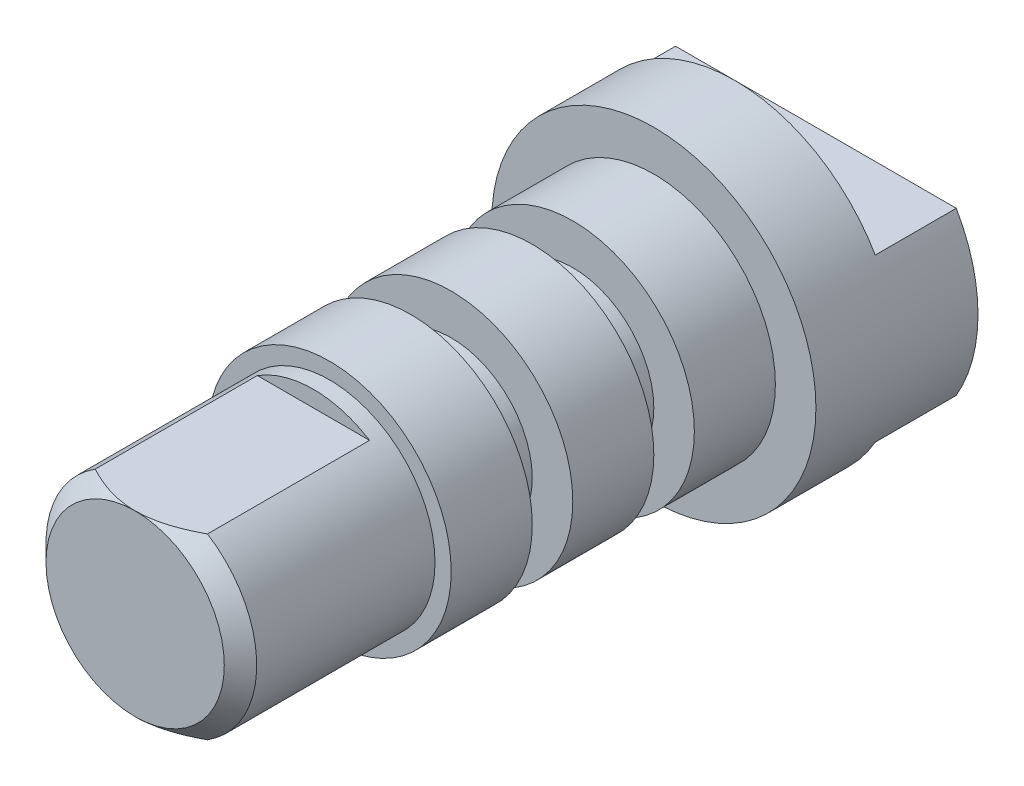
ISO-10303-21;
HEADER;
FILE_DESCRIPTION(('STEP AP214'),'2;1');
FILE_NAME('part.step','',(''),(''),'','','');
FILE_SCHEMA(('AUTOMOTIVE_DESIGN { 1 0 10303 214 1 1 1 1 }'));
ENDSEC;
DATA;
#1=APPLICATION_CONTEXT('core data for automotive mechanical design processes');
#2=APPLICATION_PROTOCOL_DEFINITION('international standard','automotive_design',2000,#1);
#3=PRODUCT_CONTEXT('',#1,'mechanical');
#4=PRODUCT('Part','Part','',(#3));
#5=PRODUCT_RELATED_PRODUCT_CATEGORY('part','',(#4));
#6=PRODUCT_DEFINITION_FORMATION('','',#4);
#7=PRODUCT_DEFINITION_CONTEXT('part definition',#1,'design');
#8=PRODUCT_DEFINITION('design','',#6,#7);
#9=PRODUCT_DEFINITION_SHAPE('','',#8);
#10=(LENGTH_UNIT() NAMED_UNIT(*) SI_UNIT(.MILLI.,.METRE.));
#11=(NAMED_UNIT(*) PLANE_ANGLE_UNIT() SI_UNIT($,.RADIAN.));
#12=(NAMED_UNIT(*) SI_UNIT($,.STERADIAN.) SOLID_ANGLE_UNIT());
#13=UNCERTAINTY_MEASURE_WITH_UNIT(LENGTH_MEASURE(1.E-05),#10,'distance_accuracy_value','');
#14=(GEOMETRIC_REPRESENTATION_CONTEXT(3) GLOBAL_UNCERTAINTY_ASSIGNED_CONTEXT((#13)) GLOBAL_UNIT_ASSIGNED_CONTEXT((#10,
#11,#12)) REPRESENTATION_CONTEXT('',''));
#15=CARTESIAN_POINT('',(0.,0.,0.));
#16=DIRECTION('',(0.,0.,1.));
#17=DIRECTION('',(1.,0.,0.));
#18=AXIS2_PLACEMENT_3D('',#15,#16,#17);
#19=CARTESIAN_POINT('',(0.,0.,5.));
#20=DIRECTION('',(0.,0.,-1.));
#21=DIRECTION('',(-1.,0.,0.));
#22=AXIS2_PLACEMENT_3D('',#19,#20,#21);
#23=CYLINDRICAL_SURFACE('',#22,10.);
#24=CARTESIAN_POINT('',(0.,0.,5.));
#25=DIRECTION('',(0.,0.,1.));
#26=DIRECTION('',(1.,0.,0.));
#27=AXIS2_PLACEMENT_3D('',#24,#25,#26);
#28=CIRCLE('',#27,10.);
#29=CARTESIAN_POINT('',(10.,0.,5.));
#30=VERTEX_POINT('',#29);
#31=EDGE_CURVE('E201',#30,#30,#28,.T.);
#32=ORIENTED_EDGE('',*,*,#31,.F.);
#33=EDGE_LOOP('',(#32));
#34=FACE_BOUND('',#33,.T.);
#35=CARTESIAN_POINT('',(0.,0.,0.));
#36=DIRECTION('',(0.,0.,-1.));
#37=DIRECTION('',(1.,0.,0.));
#38=AXIS2_PLACEMENT_3D('',#35,#36,#37);
#39=CIRCLE('',#38,10.);
#40=CARTESIAN_POINT('',(-8.66025403784439,5.,0.));
#41=VERTEX_POINT('',#40);
#42=CARTESIAN_POINT('',(8.66025403784438,5.,0.));
#43=VERTEX_POINT('',#42);
#44=EDGE_CURVE('E118',#41,#43,#39,.T.);
#45=ORIENTED_EDGE('',*,*,#44,.F.);
#46=DIRECTION('',(0.,0.,-1.));
#47=VECTOR('',#46,1.);
#48=CARTESIAN_POINT('',(-8.66025403784439,5.,0.));
#49=LINE('',#48,#47);
#50=CARTESIAN_POINT('',(-8.66025403784439,5.,-5.));
#51=VERTEX_POINT('',#50);
#52=EDGE_CURVE('E131',#41,#51,#49,.T.);
#53=ORIENTED_EDGE('',*,*,#52,.T.);
#54=CARTESIAN_POINT('',(0.,0.,-5.));
#55=DIRECTION('',(0.,0.,-1.));
#56=DIRECTION('',(-1.,0.,0.));
#57=AXIS2_PLACEMENT_3D('',#54,#55,#56);
#58=CIRCLE('',#57,10.);
#59=CARTESIAN_POINT('',(-8.66025403784439,-5.,-5.));
#60=VERTEX_POINT('',#59);
#61=EDGE_CURVE('E138',#60,#51,#58,.T.);
#62=ORIENTED_EDGE('',*,*,#61,.F.);
#63=DIRECTION('',(0.,0.,-1.));
#64=VECTOR('',#63,1.);
#65=CARTESIAN_POINT('',(-8.66025403784439,-5.,0.));
#66=LINE('',#65,#64);
#67=CARTESIAN_POINT('',(-8.66025403784439,-5.,0.));
#68=VERTEX_POINT('',#67);
#69=EDGE_CURVE('E142',#68,#60,#66,.T.);
#70=ORIENTED_EDGE('',*,*,#69,.F.);
#71=CARTESIAN_POINT('',(0.,0.,0.));
#72=DIRECTION('',(0.,0.,-1.));
#73=DIRECTION('',(-1.,0.,0.));
#74=AXIS2_PLACEMENT_3D('',#71,#72,#73);
#75=CIRCLE('',#74,10.);
#76=CARTESIAN_POINT('',(8.66025403784438,-5.,0.));
#77=VERTEX_POINT('',#76);
#78=EDGE_CURVE('E149',#77,#68,#75,.T.);
#79=ORIENTED_EDGE('',*,*,#78,.F.);
#80=DIRECTION('',(0.,0.,-1.));
#81=VECTOR('',#80,1.);
#82=CARTESIAN_POINT('',(8.66025403784438,-5.,0.));
#83=LINE('',#82,#81);
#84=CARTESIAN_POINT('',(8.66025403784438,-5.,-5.));
#85=VERTEX_POINT('',#84);
#86=EDGE_CURVE('E145',#77,#85,#83,.T.);
#87=ORIENTED_EDGE('',*,*,#86,.T.);
#88=CARTESIAN_POINT('',(8.66025403784439,5.,-5.));
#89=VERTEX_POINT('',#88);
#90=EDGE_CURVE('E136',#89,#85,#58,.T.);
#91=ORIENTED_EDGE('',*,*,#90,.F.);
#92=DIRECTION('',(0.,0.,-1.));
#93=VECTOR('',#92,1.);
#94=CARTESIAN_POINT('',(8.66025403784438,5.,0.));
#95=LINE('',#94,#93);
#96=EDGE_CURVE('E129',#43,#89,#95,.T.);
#97=ORIENTED_EDGE('',*,*,#96,.F.);
#98=EDGE_LOOP('',(#45,#53,#62,#70,#79,#87,#91,#97));
#99=FACE_BOUND('',#98,.T.);
#100=ADVANCED_FACE('F41',(#34,#99),#23,.T.);
#101=CARTESIAN_POINT('',(0.,0.,5.));
#102=DIRECTION('',(0.,0.,1.));
#103=DIRECTION('',(1.,0.,0.));
#104=AXIS2_PLACEMENT_3D('',#101,#102,#103);
#105=PLANE('',#104);
#106=CARTESIAN_POINT('',(0.,0.,5.));
#107=DIRECTION('',(0.,0.,1.));
#108=DIRECTION('',(1.,0.,0.));
#109=AXIS2_PLACEMENT_3D('',#106,#107,#108);
#110=CIRCLE('',#109,7.5);
#111=CARTESIAN_POINT('',(7.5,0.,5.));
#112=VERTEX_POINT('',#111);
#113=EDGE_CURVE('E198',#112,#112,#110,.T.);
#114=ORIENTED_EDGE('',*,*,#113,.F.);
#115=EDGE_LOOP('',(#114));
#116=FACE_BOUND('',#115,.T.);
#117=ORIENTED_EDGE('',*,*,#31,.T.);
#118=EDGE_LOOP('',(#117));
#119=FACE_BOUND('',#118,.T.);
#120=ADVANCED_FACE('F274',(#116,#119),#105,.T.);
#121=CARTESIAN_POINT('',(0.,0.,10.));
#122=DIRECTION('',(0.,0.,-1.));
#123=DIRECTION('',(-1.,0.,0.));
#124=AXIS2_PLACEMENT_3D('',#121,#122,#123);
#125=CYLINDRICAL_SURFACE('',#124,7.5);
#126=CARTESIAN_POINT('',(0.,0.,10.));
#127=DIRECTION('',(0.,0.,1.));
#128=DIRECTION('',(1.,0.,0.));
#129=AXIS2_PLACEMENT_3D('',#126,#127,#128);
#130=CIRCLE('',#129,7.5);
#131=CARTESIAN_POINT('',(7.5,0.,10.));
#132=VERTEX_POINT('',#131);
#133=EDGE_CURVE('E195',#132,#132,#130,.T.);
#134=ORIENTED_EDGE('',*,*,#133,.F.);
#135=EDGE_LOOP('',(#134));
#136=FACE_BOUND('',#135,.T.);
#137=ORIENTED_EDGE('',*,*,#113,.T.);
#138=EDGE_LOOP('',(#137));
#139=FACE_BOUND('',#138,.T.);
#140=ADVANCED_FACE('F282',(#136,#139),#125,.T.);
#141=CARTESIAN_POINT('',(0.,0.,10.));
#142=DIRECTION('',(0.,0.,1.));
#143=DIRECTION('',(1.,0.,0.));
#144=AXIS2_PLACEMENT_3D('',#141,#142,#143);
#145=PLANE('',#144);
#146=CARTESIAN_POINT('',(0.,0.,10.));
#147=DIRECTION('',(0.,0.,1.));
#148=DIRECTION('',(1.,0.,0.));
#149=AXIS2_PLACEMENT_3D('',#146,#147,#148);
#150=CIRCLE('',#149,5.);
#151=CARTESIAN_POINT('',(5.,0.,10.));
#152=VERTEX_POINT('',#151);
#153=EDGE_CURVE('E186',#152,#152,#150,.T.);
#154=ORIENTED_EDGE('',*,*,#153,.F.);
#155=EDGE_LOOP('',(#154));
#156=FACE_BOUND('',#155,.T.);
#157=ORIENTED_EDGE('',*,*,#133,.T.);
#158=EDGE_LOOP('',(#157));
#159=FACE_BOUND('',#158,.T.);
#160=ADVANCED_FACE('F296',(#156,#159),#145,.T.);
#161=CARTESIAN_POINT('',(0.,0.,12.5));
#162=DIRECTION('',(0.,0.,-1.));
#163=DIRECTION('',(-1.,0.,0.));
#164=AXIS2_PLACEMENT_3D('',#161,#162,#163);
#165=CYLINDRICAL_SURFACE('',#164,5.);
#166=CARTESIAN_POINT('',(0.,0.,12.5));
#167=DIRECTION('',(0.,0.,1.));
#168=DIRECTION('',(1.,0.,0.));
#169=AXIS2_PLACEMENT_3D('',#166,#167,#168);
#170=CIRCLE('',#169,5.);
#171=CARTESIAN_POINT('',(5.,0.,12.5));
#172=VERTEX_POINT('',#171);
#173=EDGE_CURVE('E190',#172,#172,#170,.T.);
#174=ORIENTED_EDGE('',*,*,#173,.F.);
#175=EDGE_LOOP('',(#174));
#176=FACE_BOUND('',#175,.T.);
#177=ORIENTED_EDGE('',*,*,#153,.T.);
#178=EDGE_LOOP('',(#177));
#179=FACE_BOUND('',#178,.T.);
#180=ADVANCED_FACE('F300',(#176,#179),#165,.T.);
#181=CARTESIAN_POINT('',(0.,0.,17.5));
#182=DIRECTION('',(0.,0.,-1.));
#183=DIRECTION('',(-1.,0.,0.));
#184=AXIS2_PLACEMENT_3D('',#181,#182,#183);
#185=CYLINDRICAL_SURFACE('',#184,7.5);
#186=CARTESIAN_POINT('',(0.,0.,17.5));
#187=DIRECTION('',(0.,0.,1.));
#188=DIRECTION('',(1.,0.,0.));
#189=AXIS2_PLACEMENT_3D('',#186,#187,#188);
#190=CIRCLE('',#189,7.5);
#191=CARTESIAN_POINT('',(7.5,0.,17.5));
#192=VERTEX_POINT('',#191);
#193=EDGE_CURVE('E187',#192,#192,#190,.T.);
#194=ORIENTED_EDGE('',*,*,#193,.F.);
#195=EDGE_LOOP('',(#194));
#196=FACE_BOUND('',#195,.T.);
#197=CARTESIAN_POINT('',(0.,0.,12.5));
#198=DIRECTION('',(0.,0.,1.));
#199=DIRECTION('',(1.,0.,0.));
#200=AXIS2_PLACEMENT_3D('',#197,#198,#199);
#201=CIRCLE('',#200,7.5);
#202=CARTESIAN_POINT('',(7.5,0.,12.5));
#203=VERTEX_POINT('',#202);
#204=EDGE_CURVE('E183',#203,#203,#201,.T.);
#205=ORIENTED_EDGE('',*,*,#204,.T.);
#206=EDGE_LOOP('',(#205));
#207=FACE_BOUND('',#206,.T.);
#208=ADVANCED_FACE('F304',(#196,#207),#185,.T.);
#209=CARTESIAN_POINT('',(0.,0.,17.5));
#210=DIRECTION('',(0.,0.,1.));
#211=DIRECTION('',(1.,0.,0.));
#212=AXIS2_PLACEMENT_3D('',#209,#210,#211);
#213=PLANE('',#212);
#214=CARTESIAN_POINT('',(0.,0.,17.5));
#215=DIRECTION('',(0.,0.,1.));
#216=DIRECTION('',(1.,0.,0.));
#217=AXIS2_PLACEMENT_3D('',#214,#215,#216);
#218=CIRCLE('',#217,5.);
#219=CARTESIAN_POINT('',(5.,0.,17.5));
#220=VERTEX_POINT('',#219);
#221=EDGE_CURVE('E174',#220,#220,#218,.T.);
#222=ORIENTED_EDGE('',*,*,#221,.F.);
#223=EDGE_LOOP('',(#222));
#224=FACE_BOUND('',#223,.T.);
#225=ORIENTED_EDGE('',*,*,#193,.T.);
#226=EDGE_LOOP('',(#225));
#227=FACE_BOUND('',#226,.T.);
#228=ADVANCED_FACE('F308',(#224,#227),#213,.T.);
#229=CARTESIAN_POINT('',(0.,0.,12.5));
#230=DIRECTION('',(0.,0.,1.));
#231=DIRECTION('',(1.,0.,0.));
#232=AXIS2_PLACEMENT_3D('',#229,#230,#231);
#233=PLANE('',#232);
#234=ORIENTED_EDGE('',*,*,#173,.T.);
#235=EDGE_LOOP('',(#234));
#236=FACE_BOUND('',#235,.T.);
#237=ORIENTED_EDGE('',*,*,#204,.F.);
#238=EDGE_LOOP('',(#237));
#239=FACE_BOUND('',#238,.T.);
#240=ADVANCED_FACE('F310',(#236,#239),#233,.F.);
#241=CARTESIAN_POINT('',(0.,0.,20.));
#242=DIRECTION('',(0.,0.,-1.));
#243=DIRECTION('',(-1.,0.,0.));
#244=AXIS2_PLACEMENT_3D('',#241,#242,#243);
#245=CYLINDRICAL_SURFACE('',#244,5.);
#246=CARTESIAN_POINT('',(0.,0.,20.));
#247=DIRECTION('',(0.,0.,1.));
#248=DIRECTION('',(1.,0.,0.));
#249=AXIS2_PLACEMENT_3D('',#246,#247,#248);
#250=CIRCLE('',#249,5.);
#251=CARTESIAN_POINT('',(5.,0.,20.));
#252=VERTEX_POINT('',#251);
#253=EDGE_CURVE('E178',#252,#252,#250,.T.);
#254=ORIENTED_EDGE('',*,*,#253,.F.);
#255=EDGE_LOOP('',(#254));
#256=FACE_BOUND('',#255,.T.);
#257=ORIENTED_EDGE('',*,*,#221,.T.);
#258=EDGE_LOOP('',(#257));
#259=FACE_BOUND('',#258,.T.);
#260=ADVANCED_FACE('F313',(#256,#259),#245,.T.);
#261=CARTESIAN_POINT('',(0.,0.,25.));
#262=DIRECTION('',(0.,0.,-1.));
#263=DIRECTION('',(-1.,0.,0.));
#264=AXIS2_PLACEMENT_3D('',#261,#262,#263);
#265=CYLINDRICAL_SURFACE('',#264,7.5);
#266=CARTESIAN_POINT('',(0.,0.,25.));
#267=DIRECTION('',(0.,0.,1.));
#268=DIRECTION('',(1.,0.,0.));
#269=AXIS2_PLACEMENT_3D('',#266,#267,#268);
#270=CIRCLE('',#269,7.5);
#271=CARTESIAN_POINT('',(7.5,0.,25.));
#272=VERTEX_POINT('',#271);
#273=EDGE_CURVE('E175',#272,#272,#270,.T.);
#274=ORIENTED_EDGE('',*,*,#273,.F.);
#275=EDGE_LOOP('',(#274));
#276=FACE_BOUND('',#275,.T.);
#277=CARTESIAN_POINT('',(0.,0.,20.));
#278=DIRECTION('',(0.,0.,1.));
#279=DIRECTION('',(1.,0.,0.));
#280=AXIS2_PLACEMENT_3D('',#277,#278,#279);
#281=CIRCLE('',#280,7.5);
#282=CARTESIAN_POINT('',(7.5,0.,20.));
#283=VERTEX_POINT('',#282);
#284=EDGE_CURVE('E169',#283,#283,#281,.T.);
#285=ORIENTED_EDGE('',*,*,#284,.T.);
#286=EDGE_LOOP('',(#285));
#287=FACE_BOUND('',#286,.T.);
#288=ADVANCED_FACE('F320',(#276,#287),#265,.T.);
#289=CARTESIAN_POINT('',(0.,0.,25.));
#290=DIRECTION('',(0.,0.,1.));
#291=DIRECTION('',(1.,0.,0.));
#292=AXIS2_PLACEMENT_3D('',#289,#290,#291);
#293=PLANE('',#292);
#294=CARTESIAN_POINT('',(0.,0.,25.));
#295=DIRECTION('',(0.,0.,1.));
#296=DIRECTION('',(1.,0.,0.));
#297=AXIS2_PLACEMENT_3D('',#294,#295,#296);
#298=CIRCLE('',#297,6.5);
#299=CARTESIAN_POINT('',(6.5,0.,25.));
#300=VERTEX_POINT('',#299);
#301=EDGE_CURVE('E170',#300,#300,#298,.T.);
#302=ORIENTED_EDGE('',*,*,#301,.F.);
#303=EDGE_LOOP('',(#302));
#304=FACE_BOUND('',#303,.T.);
#305=ORIENTED_EDGE('',*,*,#273,.T.);
#306=EDGE_LOOP('',(#305));
#307=FACE_BOUND('',#306,.T.);
#308=ADVANCED_FACE('F324',(#304,#307),#293,.T.);
#309=CARTESIAN_POINT('',(0.,0.,20.));
#310=DIRECTION('',(0.,0.,1.));
#311=DIRECTION('',(1.,0.,0.));
#312=AXIS2_PLACEMENT_3D('',#309,#310,#311);
#313=PLANE('',#312);
#314=ORIENTED_EDGE('',*,*,#253,.T.);
#315=EDGE_LOOP('',(#314));
#316=FACE_BOUND('',#315,.T.);
#317=ORIENTED_EDGE('',*,*,#284,.F.);
#318=EDGE_LOOP('',(#317));
#319=FACE_BOUND('',#318,.T.);
#320=ADVANCED_FACE('F326',(#316,#319),#313,.F.);
#321=CARTESIAN_POINT('',(0.,0.,37.));
#322=DIRECTION('',(0.,0.,-1.));
#323=DIRECTION('',(-1.,0.,0.));
#324=AXIS2_PLACEMENT_3D('',#321,#322,#323);
#325=CYLINDRICAL_SURFACE('',#324,6.5);
#326=DIRECTION('',(0.,0.,-1.));
#327=VECTOR('',#326,1.);
#328=CARTESIAN_POINT('',(3.46410161513776,5.5,37.));
#329=LINE('',#328,#327);
#330=CARTESIAN_POINT('',(3.46410161513776,5.5,26.));
#331=VERTEX_POINT('',#330);
#332=CARTESIAN_POINT('',(3.46410161513776,5.5,36.));
#333=VERTEX_POINT('',#332);
#334=EDGE_CURVE('E165',#331,#333,#329,.F.);
#335=ORIENTED_EDGE('',*,*,#334,.T.);
#336=CARTESIAN_POINT('',(0.,0.,36.));
#337=DIRECTION('',(0.,0.,1.));
#338=DIRECTION('',(1.,0.,0.));
#339=AXIS2_PLACEMENT_3D('',#336,#337,#338);
#340=CIRCLE('',#339,6.5);
#341=CARTESIAN_POINT('',(3.46410161513776,-5.5,36.));
#342=VERTEX_POINT('',#341);
#343=EDGE_CURVE('E69',#333,#342,#340,.F.);
#344=ORIENTED_EDGE('',*,*,#343,.T.);
#345=DIRECTION('',(0.,0.,-1.));
#346=VECTOR('',#345,1.);
#347=CARTESIAN_POINT('',(3.46410161513776,-5.5,37.));
#348=LINE('',#347,#346);
#349=CARTESIAN_POINT('',(3.46410161513776,-5.5,26.));
#350=VERTEX_POINT('',#349);
#351=EDGE_CURVE('E163',#342,#350,#348,.T.);
#352=ORIENTED_EDGE('',*,*,#351,.T.);
#353=CARTESIAN_POINT('',(0.,0.,26.));
#354=DIRECTION('',(0.,0.,-1.));
#355=DIRECTION('',(-1.,0.,0.));
#356=AXIS2_PLACEMENT_3D('',#353,#354,#355);
#357=CIRCLE('',#356,6.5);
#358=CARTESIAN_POINT('',(-3.46410161513776,-5.5,26.));
#359=VERTEX_POINT('',#358);
#360=EDGE_CURVE('E173',#350,#359,#357,.T.);
#361=ORIENTED_EDGE('',*,*,#360,.T.);
#362=DIRECTION('',(0.,0.,-1.));
#363=VECTOR('',#362,1.);
#364=CARTESIAN_POINT('',(-3.46410161513776,-5.5,37.));
#365=LINE('',#364,#363);
#366=CARTESIAN_POINT('',(-3.46410161513776,-5.5,36.));
#367=VERTEX_POINT('',#366);
#368=EDGE_CURVE('E158',#359,#367,#365,.F.);
#369=ORIENTED_EDGE('',*,*,#368,.T.);
#370=CARTESIAN_POINT('',(0.,0.,36.));
#371=DIRECTION('',(0.,0.,1.));
#372=DIRECTION('',(1.,0.,0.));
#373=AXIS2_PLACEMENT_3D('',#370,#371,#372);
#374=CIRCLE('',#373,6.5);
#375=CARTESIAN_POINT('',(-3.46410161513776,5.5,36.));
#376=VERTEX_POINT('',#375);
#377=EDGE_CURVE('E252',#367,#376,#374,.F.);
#378=ORIENTED_EDGE('',*,*,#377,.T.);
#379=DIRECTION('',(0.,0.,-1.));
#380=VECTOR('',#379,1.);
#381=CARTESIAN_POINT('',(-3.46410161513776,5.5,37.));
#382=LINE('',#381,#380);
#383=CARTESIAN_POINT('',(-3.46410161513776,5.5,26.));
#384=VERTEX_POINT('',#383);
#385=EDGE_CURVE('E167',#376,#384,#382,.T.);
#386=ORIENTED_EDGE('',*,*,#385,.T.);
#387=CARTESIAN_POINT('',(0.,0.,26.));
#388=DIRECTION('',(0.,0.,1.));
#389=DIRECTION('',(1.,0.,0.));
#390=AXIS2_PLACEMENT_3D('',#387,#388,#389);
#391=CIRCLE('',#390,6.5);
#392=EDGE_CURVE('E208',#331,#384,#391,.T.);
#393=ORIENTED_EDGE('',*,*,#392,.F.);
#394=EDGE_LOOP('',(#335,#344,#352,#361,#369,#378,#386,#393));
#395=FACE_BOUND('',#394,.T.);
#396=ORIENTED_EDGE('',*,*,#301,.T.);
#397=EDGE_LOOP('',(#396));
#398=FACE_BOUND('',#397,.T.);
#399=ADVANCED_FACE('F260',(#395,#398),#325,.T.);
#400=CARTESIAN_POINT('',(0.,0.,37.));
#401=DIRECTION('',(0.,0.,1.));
#402=DIRECTION('',(1.,0.,0.));
#403=AXIS2_PLACEMENT_3D('',#400,#401,#402);
#404=PLANE('',#403);
#405=CARTESIAN_POINT('',(0.,0.,37.));
#406=DIRECTION('',(0.,0.,1.));
#407=DIRECTION('',(1.,0.,0.));
#408=AXIS2_PLACEMENT_3D('',#405,#406,#407);
#409=CIRCLE('',#408,5.50000000000001);
#410=CARTESIAN_POINT('',(0.,5.5,37.));
#411=VERTEX_POINT('',#410);
#412=CARTESIAN_POINT('',(0.,-5.5,37.));
#413=VERTEX_POINT('',#412);
#414=EDGE_CURVE('E211',#411,#413,#409,.T.);
#415=ORIENTED_EDGE('',*,*,#414,.T.);
#416=CARTESIAN_POINT('',(0.,0.,37.));
#417=DIRECTION('',(0.,0.,1.));
#418=DIRECTION('',(1.,0.,0.));
#419=AXIS2_PLACEMENT_3D('',#416,#417,#418);
#420=CIRCLE('',#419,5.50000000000001);
#421=EDGE_CURVE('E214',#413,#411,#420,.T.);
#422=ORIENTED_EDGE('',*,*,#421,.T.);
#423=EDGE_LOOP('',(#415,#422));
#424=FACE_BOUND('',#423,.T.);
#425=ADVANCED_FACE('F267',(#424),#404,.T.);
#426=CARTESIAN_POINT('',(0.,0.,26.));
#427=DIRECTION('',(0.,0.,-1.));
#428=DIRECTION('',(-1.,0.,0.));
#429=AXIS2_PLACEMENT_3D('',#426,#427,#428);
#430=PLANE('',#429);
#431=DIRECTION('',(-1.,0.,0.));
#432=VECTOR('',#431,1.);
#433=CARTESIAN_POINT('',(-4.,-5.5,26.));
#434=LINE('',#433,#432);
#435=EDGE_CURVE('E159',#350,#359,#434,.T.);
#436=ORIENTED_EDGE('',*,*,#435,.T.);
#437=ORIENTED_EDGE('',*,*,#360,.F.);
#438=EDGE_LOOP('',(#436,#437));
#439=FACE_BOUND('',#438,.T.);
#440=ADVANCED_FACE('F244',(#439),#430,.F.);
#441=CARTESIAN_POINT('',(-4.,-5.5,26.));
#442=DIRECTION('',(0.,1.,0.));
#443=DIRECTION('',(0.,0.,1.));
#444=AXIS2_PLACEMENT_3D('',#441,#442,#443);
#445=PLANE('',#444);
#446=ORIENTED_EDGE('',*,*,#351,.F.);
#447=CARTESIAN_POINT('',(3.46410161513776,-5.5,36.));
#448=CARTESIAN_POINT('',(3.36639231048485,-5.5,36.0520670063043));
#449=CARTESIAN_POINT('',(3.26803477504347,-5.5,36.102914573613));
#450=CARTESIAN_POINT('',(3.06989646737792,-5.5,36.2018354319516));
#451=CARTESIAN_POINT('',(2.97011524485663,-5.5,36.2499078198237));
#452=CARTESIAN_POINT('',(2.66772032538694,-5.5,36.3897889742277));
#453=CARTESIAN_POINT('',(2.46285195615752,-5.5,36.4768305432994));
#454=CARTESIAN_POINT('',(2.05214101589369,-5.5,36.6326212757393));
#455=CARTESIAN_POINT('',(1.84645521756864,-5.5,36.7017787338366));
#456=CARTESIAN_POINT('',(1.42984977919961,-5.5,36.8206703988509));
#457=CARTESIAN_POINT('',(1.21894122602479,-5.5,36.8704425313218));
#458=CARTESIAN_POINT('',(0.840833175891051,-5.5,36.9384694427188));
#459=CARTESIAN_POINT('',(0.67446382804407,-5.5,36.9612936697113));
#460=CARTESIAN_POINT('',(0.423098145503105,-5.5,36.9843908290548));
#461=CARTESIAN_POINT('',(0.338591444805938,-5.5,36.9902341434836));
#462=CARTESIAN_POINT('',(0.169393495526896,-5.5,36.9980426172977));
#463=CARTESIAN_POINT('',(0.084702234269931,-5.5,37.0000075013453));
#464=CARTESIAN_POINT('',(0.,-5.5,37.));
#465=B_SPLINE_CURVE_WITH_KNOTS('',3,(#447,#448,#449,#450,#451,#452,#453,#454,#455,#456,#457,
#458,#459,#460,#461,#462,#463,#464),.UNSPECIFIED.,.F.,.F.,(4,2,2,2,2,2,2,2,4),(0.,
0.332131746596434,0.664370980166013,1.33156261056563,1.98181606925444,2.63079090057968,
3.13390574239052,3.38795081114665,3.6420139144342),.UNSPECIFIED.);
#466=EDGE_CURVE('E11',#342,#413,#465,.T.);
#467=ORIENTED_EDGE('',*,*,#466,.T.);
#468=CARTESIAN_POINT('',(0.,-5.50000000000001,37.));
#469=CARTESIAN_POINT('',(-0.0845024363328516,-5.5,37.0000067814901));
#470=CARTESIAN_POINT('',(-0.168992270115318,-5.5,36.9980515717066));
#471=CARTESIAN_POINT('',(-0.337781227576542,-5.5,36.9902810080754));
#472=CARTESIAN_POINT('',(-0.42208037940213,-5.5,36.9844662670954));
#473=CARTESIAN_POINT('',(-0.674140359222895,-5.5,36.9613590225217));
#474=CARTESIAN_POINT('',(-0.841409941455969,-5.5,36.938402974733));
#475=CARTESIAN_POINT('',(-1.17077816997709,-5.5,36.8790706584935));
#476=CARTESIAN_POINT('',(-1.33291677161126,-5.5,36.842910391959));
#477=CARTESIAN_POINT('',(-1.6541236229531,-5.5,36.7587383984197));
#478=CARTESIAN_POINT('',(-1.81319072205355,-5.5,36.7107223195704));
#479=CARTESIAN_POINT('',(-2.09870498397789,-5.5,36.6144252279604));
#480=CARTESIAN_POINT('',(-2.22573383883002,-5.5,36.567842705042));
#481=CARTESIAN_POINT('',(-2.47748844482363,-5.5,36.4688676200951));
#482=CARTESIAN_POINT('',(-2.60221437645001,-5.5,36.4164755156495));
#483=CARTESIAN_POINT('',(-2.85109955016192,-5.5,36.3059583536269));
#484=CARTESIAN_POINT('',(-2.97522850343495,-5.5,36.2477655516057));
#485=CARTESIAN_POINT('',(-3.22127572386167,-5.5,36.1269952594492));
#486=CARTESIAN_POINT('',(-3.34319488433789,-5.5,36.0644195932319));
#487=CARTESIAN_POINT('',(-3.46410161513775,-5.5,36.));
#488=B_SPLINE_CURVE_WITH_KNOTS('',3,(#468,#469,#470,#471,#472,#473,#474,#475,#476,#477,#478,
#479,#480,#481,#482,#483,#484,#485,#486,#487),.UNSPECIFIED.,.F.,.F.,(4,2,2,2,2,2,2,2,2,4),(0.,
0.253460599446801,0.506880960669014,1.01268690060144,1.51056434932941,2.00862482344102,
2.41437502517771,2.82009329128061,3.23127917720927,3.6422949543544),.UNSPECIFIED.);
#489=EDGE_CURVE('E56',#413,#367,#488,.T.);
#490=ORIENTED_EDGE('',*,*,#489,.T.);
#491=ORIENTED_EDGE('',*,*,#368,.F.);
#492=ORIENTED_EDGE('',*,*,#435,.F.);
#493=EDGE_LOOP('',(#446,#467,#490,#491,#492));
#494=FACE_BOUND('',#493,.T.);
#495=ADVANCED_FACE('F239',(#494),#445,.F.);
#496=CARTESIAN_POINT('',(0.,0.,26.));
#497=DIRECTION('',(0.,0.,1.));
#498=DIRECTION('',(1.,0.,0.));
#499=AXIS2_PLACEMENT_3D('',#496,#497,#498);
#500=PLANE('',#499);
#501=ORIENTED_EDGE('',*,*,#392,.T.);
#502=DIRECTION('',(1.,0.,0.));
#503=VECTOR('',#502,1.);
#504=CARTESIAN_POINT('',(-4.,5.5,26.));
#505=LINE('',#504,#503);
#506=EDGE_CURVE('E155',#384,#331,#505,.T.);
#507=ORIENTED_EDGE('',*,*,#506,.T.);
#508=EDGE_LOOP('',(#501,#507));
#509=FACE_BOUND('',#508,.T.);
#510=ADVANCED_FACE('F236',(#509),#500,.T.);
#511=CARTESIAN_POINT('',(-4.,5.5,26.));
#512=DIRECTION('',(0.,-1.,0.));
#513=DIRECTION('',(0.,0.,-1.));
#514=AXIS2_PLACEMENT_3D('',#511,#512,#513);
#515=PLANE('',#514);
#516=CARTESIAN_POINT('',(-3.46410161513776,5.5,36.));
#517=CARTESIAN_POINT('',(-3.36639231048485,5.5,36.0520670063043));
#518=CARTESIAN_POINT('',(-3.26803477504347,5.5,36.102914573613));
#519=CARTESIAN_POINT('',(-3.06989646737792,5.5,36.2018354319516));
#520=CARTESIAN_POINT('',(-2.97011524485663,5.5,36.2499078198237));
#521=CARTESIAN_POINT('',(-2.66772032538694,5.5,36.3897889742277));
#522=CARTESIAN_POINT('',(-2.46285195615752,5.5,36.4768305432994));
#523=CARTESIAN_POINT('',(-2.05214101589369,5.5,36.6326212757393));
#524=CARTESIAN_POINT('',(-1.84645521756864,5.5,36.7017787338366));
#525=CARTESIAN_POINT('',(-1.42984977919961,5.5,36.8206703988509));
#526=CARTESIAN_POINT('',(-1.21894122602479,5.5,36.8704425313218));
#527=CARTESIAN_POINT('',(-0.840833175891051,5.5,36.9384694427188));
#528=CARTESIAN_POINT('',(-0.67446382804407,5.5,36.9612936697113));
#529=CARTESIAN_POINT('',(-0.423098145503105,5.5,36.9843908290548));
#530=CARTESIAN_POINT('',(-0.338591444805938,5.5,36.9902341434836));
#531=CARTESIAN_POINT('',(-0.169393495526896,5.5,36.9980426172977));
#532=CARTESIAN_POINT('',(-0.084702234269931,5.5,37.0000075013453));
#533=CARTESIAN_POINT('',(0.,5.5,37.));
#534=B_SPLINE_CURVE_WITH_KNOTS('',3,(#516,#517,#518,#519,#520,#521,#522,#523,#524,#525,#526,
#527,#528,#529,#530,#531,#532,#533),.UNSPECIFIED.,.F.,.F.,(4,2,2,2,2,2,2,2,4),(0.,
0.332131746596434,0.664370980166013,1.33156261056563,1.98181606925444,2.63079090057968,
3.13390574239052,3.38795081114665,3.6420139144342),.UNSPECIFIED.);
#535=EDGE_CURVE('E217',#376,#411,#534,.T.);
#536=ORIENTED_EDGE('',*,*,#535,.T.);
#537=CARTESIAN_POINT('',(0.,5.50000000000001,37.));
#538=CARTESIAN_POINT('',(0.0845024363328516,5.5,37.0000067814901));
#539=CARTESIAN_POINT('',(0.168992270115318,5.5,36.9980515717066));
#540=CARTESIAN_POINT('',(0.337781227576542,5.5,36.9902810080754));
#541=CARTESIAN_POINT('',(0.42208037940213,5.5,36.9844662670954));
#542=CARTESIAN_POINT('',(0.674140359222895,5.5,36.9613590225217));
#543=CARTESIAN_POINT('',(0.841409941455969,5.5,36.938402974733));
#544=CARTESIAN_POINT('',(1.17077816997709,5.5,36.8790706584935));
#545=CARTESIAN_POINT('',(1.33291677161126,5.5,36.842910391959));
#546=CARTESIAN_POINT('',(1.6541236229531,5.5,36.7587383984197));
#547=CARTESIAN_POINT('',(1.81319072205355,5.5,36.7107223195704));
#548=CARTESIAN_POINT('',(2.09870498397789,5.5,36.6144252279604));
#549=CARTESIAN_POINT('',(2.22573383883002,5.5,36.567842705042));
#550=CARTESIAN_POINT('',(2.47748844482363,5.5,36.4688676200951));
#551=CARTESIAN_POINT('',(2.60221437645001,5.5,36.4164755156495));
#552=CARTESIAN_POINT('',(2.85109955016192,5.5,36.3059583536269));
#553=CARTESIAN_POINT('',(2.97522850343495,5.5,36.2477655516057));
#554=CARTESIAN_POINT('',(3.22127572386167,5.5,36.1269952594492));
#555=CARTESIAN_POINT('',(3.34319488433789,5.5,36.0644195932319));
#556=CARTESIAN_POINT('',(3.46410161513775,5.5,36.));
#557=B_SPLINE_CURVE_WITH_KNOTS('',3,(#537,#538,#539,#540,#541,#542,#543,#544,#545,#546,#547,
#548,#549,#550,#551,#552,#553,#554,#555,#556),.UNSPECIFIED.,.F.,.F.,(4,2,2,2,2,2,2,2,2,4),(0.,
0.253460599446801,0.506880960669014,1.01268690060144,1.51056434932941,2.00862482344102,
2.41437502517771,2.82009329128061,3.23127917720927,3.6422949543544),.UNSPECIFIED.);
#558=EDGE_CURVE('E225',#411,#333,#557,.T.);
#559=ORIENTED_EDGE('',*,*,#558,.T.);
#560=ORIENTED_EDGE('',*,*,#334,.F.);
#561=ORIENTED_EDGE('',*,*,#506,.F.);
#562=ORIENTED_EDGE('',*,*,#385,.F.);
#563=EDGE_LOOP('',(#536,#559,#560,#561,#562));
#564=FACE_BOUND('',#563,.T.);
#565=ADVANCED_FACE('F231',(#564),#515,.F.);
#566=CARTESIAN_POINT('',(0.,0.,-5.));
#567=DIRECTION('',(0.,0.,-1.));
#568=DIRECTION('',(-1.,0.,0.));
#569=AXIS2_PLACEMENT_3D('',#566,#567,#568);
#570=PLANE('',#569);
#571=DIRECTION('',(-1.,0.,0.));
#572=VECTOR('',#571,1.);
#573=CARTESIAN_POINT('',(8.66025403784438,5.,-5.));
#574=LINE('',#573,#572);
#575=EDGE_CURVE('E125',#89,#51,#574,.T.);
#576=ORIENTED_EDGE('',*,*,#575,.F.);
#577=ORIENTED_EDGE('',*,*,#90,.T.);
#578=DIRECTION('',(1.,0.,0.));
#579=VECTOR('',#578,1.);
#580=CARTESIAN_POINT('',(8.66025403784438,-5.,-5.));
#581=LINE('',#580,#579);
#582=EDGE_CURVE('E147',#60,#85,#581,.T.);
#583=ORIENTED_EDGE('',*,*,#582,.F.);
#584=ORIENTED_EDGE('',*,*,#61,.T.);
#585=EDGE_LOOP('',(#576,#577,#583,#584));
#586=FACE_BOUND('',#585,.T.);
#587=ADVANCED_FACE('F235',(#586),#570,.T.);
#588=CARTESIAN_POINT('',(8.66025403784438,-5.,0.));
#589=DIRECTION('',(0.,1.,0.));
#590=DIRECTION('',(0.,0.,1.));
#591=AXIS2_PLACEMENT_3D('',#588,#589,#590);
#592=PLANE('',#591);
#593=ORIENTED_EDGE('',*,*,#582,.T.);
#594=ORIENTED_EDGE('',*,*,#86,.F.);
#595=DIRECTION('',(1.,0.,0.));
#596=VECTOR('',#595,1.);
#597=CARTESIAN_POINT('',(8.66025403784438,-5.,0.));
#598=LINE('',#597,#596);
#599=EDGE_CURVE('E144',#68,#77,#598,.T.);
#600=ORIENTED_EDGE('',*,*,#599,.F.);
#601=ORIENTED_EDGE('',*,*,#69,.T.);
#602=EDGE_LOOP('',(#593,#594,#600,#601));
#603=FACE_BOUND('',#602,.T.);
#604=ADVANCED_FACE('F376',(#603),#592,.F.);
#605=CARTESIAN_POINT('',(0.,0.,0.));
#606=DIRECTION('',(0.,0.,-1.));
#607=DIRECTION('',(-1.,0.,0.));
#608=AXIS2_PLACEMENT_3D('',#605,#606,#607);
#609=PLANE('',#608);
#610=ORIENTED_EDGE('',*,*,#78,.T.);
#611=ORIENTED_EDGE('',*,*,#599,.T.);
#612=EDGE_LOOP('',(#610,#611));
#613=FACE_BOUND('',#612,.T.);
#614=ADVANCED_FACE('F385',(#613),#609,.T.);
#615=CARTESIAN_POINT('',(8.66025403784438,5.,0.));
#616=DIRECTION('',(0.,-1.,0.));
#617=DIRECTION('',(0.,0.,-1.));
#618=AXIS2_PLACEMENT_3D('',#615,#616,#617);
#619=PLANE('',#618);
#620=ORIENTED_EDGE('',*,*,#575,.T.);
#621=ORIENTED_EDGE('',*,*,#52,.F.);
#622=DIRECTION('',(-1.,0.,0.));
#623=VECTOR('',#622,1.);
#624=CARTESIAN_POINT('',(8.66025403784438,5.,0.));
#625=LINE('',#624,#623);
#626=EDGE_CURVE('E121',#43,#41,#625,.T.);
#627=ORIENTED_EDGE('',*,*,#626,.F.);
#628=ORIENTED_EDGE('',*,*,#96,.T.);
#629=EDGE_LOOP('',(#620,#621,#627,#628));
#630=FACE_BOUND('',#629,.T.);
#631=ADVANCED_FACE('F128',(#630),#619,.F.);
#632=CARTESIAN_POINT('',(0.,0.,0.));
#633=DIRECTION('',(0.,0.,1.));
#634=DIRECTION('',(1.,0.,0.));
#635=AXIS2_PLACEMENT_3D('',#632,#633,#634);
#636=PLANE('',#635);
#637=ORIENTED_EDGE('',*,*,#44,.T.);
#638=ORIENTED_EDGE('',*,*,#626,.T.);
#639=EDGE_LOOP('',(#637,#638));
#640=FACE_BOUND('',#639,.T.);
#641=ADVANCED_FACE('F120',(#640),#636,.F.);
#642=CARTESIAN_POINT('',(0.,0.,37.));
#643=DIRECTION('',(0.,0.,-1.));
#644=DIRECTION('',(-1.,0.,0.));
#645=AXIS2_PLACEMENT_3D('',#642,#643,#644);
#646=CONICAL_SURFACE('',#645,5.50000000000001,0.785398163397446);
#647=ORIENTED_EDGE('',*,*,#466,.F.);
#648=ORIENTED_EDGE('',*,*,#343,.F.);
#649=ORIENTED_EDGE('',*,*,#558,.F.);
#650=ORIENTED_EDGE('',*,*,#421,.F.);
#651=EDGE_LOOP('',(#647,#648,#649,#650));
#652=FACE_BOUND('',#651,.T.);
#653=ADVANCED_FACE('F263',(#652),#646,.T.);
#654=CARTESIAN_POINT('',(0.,0.,37.));
#655=DIRECTION('',(0.,0.,-1.));
#656=DIRECTION('',(-1.,0.,0.));
#657=AXIS2_PLACEMENT_3D('',#654,#655,#656);
#658=CONICAL_SURFACE('',#657,5.50000000000001,0.785398163397446);
#659=ORIENTED_EDGE('',*,*,#535,.F.);
#660=ORIENTED_EDGE('',*,*,#377,.F.);
#661=ORIENTED_EDGE('',*,*,#489,.F.);
#662=ORIENTED_EDGE('',*,*,#414,.F.);
#663=EDGE_LOOP('',(#659,#660,#661,#662));
#664=FACE_BOUND('',#663,.T.);
#665=ADVANCED_FACE('F44',(#664),#658,.T.);
#666=CLOSED_SHELL('',(#100,#120,#140,#160,#180,#208,#228,#240,#260,#288,#308,#320,#399,#425,
#440,#495,#510,#565,#587,#604,#614,#631,#641,#653,#665));
#667=MANIFOLD_SOLID_BREP('B2',#666);
#668=ADVANCED_BREP_SHAPE_REPRESENTATION('',(#18,#667),#14);
#669=SHAPE_DEFINITION_REPRESENTATION(#9,#668);
ENDSEC;
END-ISO-10303-21;
